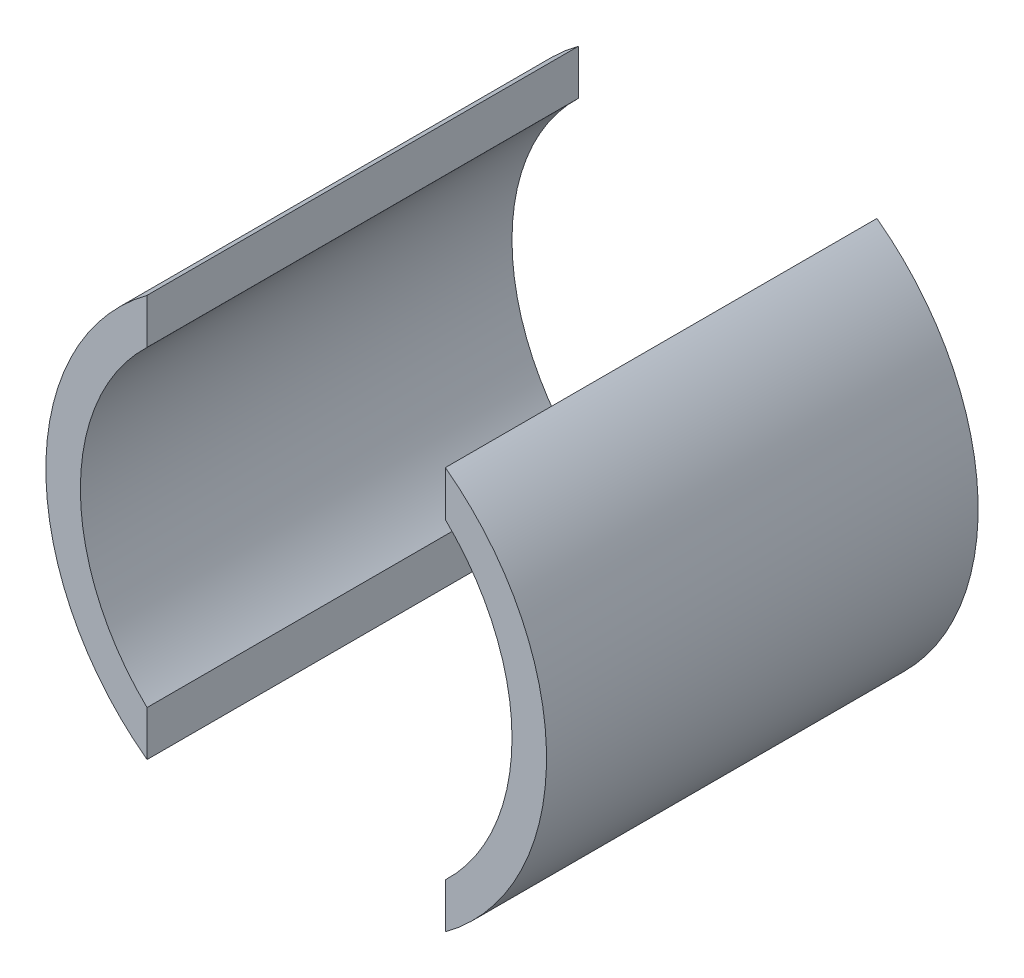
ISO-10303-21;
HEADER;
FILE_DESCRIPTION(('STEP AP214'),'2;1');
FILE_NAME('part.step','',(''),(''),'','','');
FILE_SCHEMA(('AUTOMOTIVE_DESIGN { 1 0 10303 214 1 1 1 1 }'));
ENDSEC;
DATA;
#1=APPLICATION_CONTEXT('core data for automotive mechanical design processes');
#2=APPLICATION_PROTOCOL_DEFINITION('international standard','automotive_design',2000,#1);
#3=PRODUCT_CONTEXT('',#1,'mechanical');
#4=PRODUCT('Part','Part','',(#3));
#5=PRODUCT_RELATED_PRODUCT_CATEGORY('part','',(#4));
#6=PRODUCT_DEFINITION_FORMATION('','',#4);
#7=PRODUCT_DEFINITION_CONTEXT('part definition',#1,'design');
#8=PRODUCT_DEFINITION('design','',#6,#7);
#9=PRODUCT_DEFINITION_SHAPE('','',#8);
#10=(LENGTH_UNIT() NAMED_UNIT(*) SI_UNIT(.MILLI.,.METRE.));
#11=(NAMED_UNIT(*) PLANE_ANGLE_UNIT() SI_UNIT($,.RADIAN.));
#12=(NAMED_UNIT(*) SI_UNIT($,.STERADIAN.) SOLID_ANGLE_UNIT());
#13=UNCERTAINTY_MEASURE_WITH_UNIT(LENGTH_MEASURE(1.E-05),#10,'distance_accuracy_value','');
#14=(GEOMETRIC_REPRESENTATION_CONTEXT(3) GLOBAL_UNCERTAINTY_ASSIGNED_CONTEXT((#13)) GLOBAL_UNIT_ASSIGNED_CONTEXT((#10,
#11,#12)) REPRESENTATION_CONTEXT('',''));
#15=CARTESIAN_POINT('',(0.,0.,0.));
#16=DIRECTION('',(0.,0.,1.));
#17=DIRECTION('',(1.,0.,0.));
#18=AXIS2_PLACEMENT_3D('',#15,#16,#17);
#19=CARTESIAN_POINT('',(0.,0.,50.));
#20=DIRECTION('',(0.,0.,-1.));
#21=DIRECTION('',(-1.,0.,0.));
#22=AXIS2_PLACEMENT_3D('',#19,#20,#21);
#23=CYLINDRICAL_SURFACE('',#22,25.);
#24=CARTESIAN_POINT('',(0.,0.,0.));
#25=DIRECTION('',(0.,0.,-1.));
#26=DIRECTION('',(1.,0.,0.));
#27=AXIS2_PLACEMENT_3D('',#24,#25,#26);
#28=CIRCLE('',#27,25.);
#29=CARTESIAN_POINT('',(-17.2808219178082,-18.0658017769763,0.));
#30=VERTEX_POINT('',#29);
#31=CARTESIAN_POINT('',(-17.2808219178082,18.0658017769763,0.));
#32=VERTEX_POINT('',#31);
#33=EDGE_CURVE('E112',#30,#32,#28,.T.);
#34=ORIENTED_EDGE('',*,*,#33,.T.);
#35=DIRECTION('',(0.,0.,-1.));
#36=VECTOR('',#35,1.);
#37=CARTESIAN_POINT('',(-17.2808219178082,18.0658017769763,50.));
#38=LINE('',#37,#36);
#39=CARTESIAN_POINT('',(-17.2808219178082,18.0658017769763,50.));
#40=VERTEX_POINT('',#39);
#41=EDGE_CURVE('E12',#40,#32,#38,.T.);
#42=ORIENTED_EDGE('',*,*,#41,.F.);
#43=CARTESIAN_POINT('',(0.,0.,50.));
#44=DIRECTION('',(0.,0.,-1.));
#45=DIRECTION('',(1.,0.,0.));
#46=AXIS2_PLACEMENT_3D('',#43,#44,#45);
#47=CIRCLE('',#46,25.);
#48=CARTESIAN_POINT('',(-17.2808219178082,-18.0658017769763,50.));
#49=VERTEX_POINT('',#48);
#50=EDGE_CURVE('E100',#49,#40,#47,.T.);
#51=ORIENTED_EDGE('',*,*,#50,.F.);
#52=DIRECTION('',(0.,0.,-1.));
#53=VECTOR('',#52,1.);
#54=CARTESIAN_POINT('',(-17.2808219178082,-18.0658017769763,50.));
#55=LINE('',#54,#53);
#56=EDGE_CURVE('E108',#49,#30,#55,.T.);
#57=ORIENTED_EDGE('',*,*,#56,.T.);
#58=EDGE_LOOP('',(#34,#42,#51,#57));
#59=FACE_BOUND('',#58,.T.);
#60=ADVANCED_FACE('F49',(#59),#23,.F.);
#61=CARTESIAN_POINT('',(-17.2808219178082,23.2889070985523,50.));
#62=DIRECTION('',(-1.,0.,0.));
#63=DIRECTION('',(0.,0.,1.));
#64=AXIS2_PLACEMENT_3D('',#61,#62,#63);
#65=PLANE('',#64);
#66=DIRECTION('',(0.,1.,0.));
#67=VECTOR('',#66,1.);
#68=CARTESIAN_POINT('',(-17.2808219178082,23.2889070985523,0.));
#69=LINE('',#68,#67);
#70=CARTESIAN_POINT('',(-17.2808219178082,23.2889070985523,0.));
#71=VERTEX_POINT('',#70);
#72=EDGE_CURVE('E104',#32,#71,#69,.T.);
#73=ORIENTED_EDGE('',*,*,#72,.T.);
#74=DIRECTION('',(0.,0.,-1.));
#75=VECTOR('',#74,1.);
#76=CARTESIAN_POINT('',(-17.2808219178082,23.2889070985523,50.));
#77=LINE('',#76,#75);
#78=CARTESIAN_POINT('',(-17.2808219178082,23.2889070985523,50.));
#79=VERTEX_POINT('',#78);
#80=EDGE_CURVE('E57',#79,#71,#77,.T.);
#81=ORIENTED_EDGE('',*,*,#80,.F.);
#82=DIRECTION('',(0.,1.,0.));
#83=VECTOR('',#82,1.);
#84=CARTESIAN_POINT('',(-17.2808219178082,23.2889070985523,50.));
#85=LINE('',#84,#83);
#86=EDGE_CURVE('E95',#40,#79,#85,.T.);
#87=ORIENTED_EDGE('',*,*,#86,.F.);
#88=ORIENTED_EDGE('',*,*,#41,.T.);
#89=EDGE_LOOP('',(#73,#81,#87,#88));
#90=FACE_BOUND('',#89,.T.);
#91=ADVANCED_FACE('F103',(#90),#65,.F.);
#92=CARTESIAN_POINT('',(0.,0.,50.));
#93=DIRECTION('',(0.,0.,-1.));
#94=DIRECTION('',(-1.,0.,0.));
#95=AXIS2_PLACEMENT_3D('',#92,#93,#94);
#96=CYLINDRICAL_SURFACE('',#95,29.);
#97=CARTESIAN_POINT('',(0.,0.,0.));
#98=DIRECTION('',(0.,0.,1.));
#99=DIRECTION('',(1.,0.,0.));
#100=AXIS2_PLACEMENT_3D('',#97,#98,#99);
#101=CIRCLE('',#100,29.);
#102=CARTESIAN_POINT('',(-17.2808219178082,-23.2889070985523,0.));
#103=VERTEX_POINT('',#102);
#104=EDGE_CURVE('E82',#71,#103,#101,.T.);
#105=ORIENTED_EDGE('',*,*,#104,.T.);
#106=DIRECTION('',(0.,0.,-1.));
#107=VECTOR('',#106,1.);
#108=CARTESIAN_POINT('',(-17.2808219178082,-23.2889070985523,50.));
#109=LINE('',#108,#107);
#110=CARTESIAN_POINT('',(-17.2808219178082,-23.2889070985523,50.));
#111=VERTEX_POINT('',#110);
#112=EDGE_CURVE('E105',#111,#103,#109,.T.);
#113=ORIENTED_EDGE('',*,*,#112,.F.);
#114=CARTESIAN_POINT('',(0.,0.,50.));
#115=DIRECTION('',(0.,0.,1.));
#116=DIRECTION('',(1.,0.,0.));
#117=AXIS2_PLACEMENT_3D('',#114,#115,#116);
#118=CIRCLE('',#117,29.);
#119=EDGE_CURVE('E98',#79,#111,#118,.T.);
#120=ORIENTED_EDGE('',*,*,#119,.F.);
#121=ORIENTED_EDGE('',*,*,#80,.T.);
#122=EDGE_LOOP('',(#105,#113,#120,#121));
#123=FACE_BOUND('',#122,.T.);
#124=ADVANCED_FACE('F106',(#123),#96,.T.);
#125=CARTESIAN_POINT('',(-17.2808219178082,-18.0658017769763,50.));
#126=DIRECTION('',(-1.,0.,0.));
#127=DIRECTION('',(0.,0.,1.));
#128=AXIS2_PLACEMENT_3D('',#125,#126,#127);
#129=PLANE('',#128);
#130=DIRECTION('',(0.,1.,0.));
#131=VECTOR('',#130,1.);
#132=CARTESIAN_POINT('',(-17.2808219178082,-18.0658017769763,0.));
#133=LINE('',#132,#131);
#134=EDGE_CURVE('E88',#103,#30,#133,.T.);
#135=ORIENTED_EDGE('',*,*,#134,.T.);
#136=ORIENTED_EDGE('',*,*,#56,.F.);
#137=DIRECTION('',(0.,1.,0.));
#138=VECTOR('',#137,1.);
#139=CARTESIAN_POINT('',(-17.2808219178082,-18.0658017769763,50.));
#140=LINE('',#139,#138);
#141=EDGE_CURVE('E65',#111,#49,#140,.T.);
#142=ORIENTED_EDGE('',*,*,#141,.F.);
#143=ORIENTED_EDGE('',*,*,#112,.T.);
#144=EDGE_LOOP('',(#135,#136,#142,#143));
#145=FACE_BOUND('',#144,.T.);
#146=ADVANCED_FACE('F119',(#145),#129,.F.);
#147=CARTESIAN_POINT('',(0.,0.,50.));
#148=DIRECTION('',(0.,0.,1.));
#149=DIRECTION('',(1.,0.,0.));
#150=AXIS2_PLACEMENT_3D('',#147,#148,#149);
#151=PLANE('',#150);
#152=ORIENTED_EDGE('',*,*,#50,.T.);
#153=ORIENTED_EDGE('',*,*,#86,.T.);
#154=ORIENTED_EDGE('',*,*,#119,.T.);
#155=ORIENTED_EDGE('',*,*,#141,.T.);
#156=EDGE_LOOP('',(#152,#153,#154,#155));
#157=FACE_BOUND('',#156,.T.);
#158=ADVANCED_FACE('F96',(#157),#151,.T.);
#159=CARTESIAN_POINT('',(0.,0.,0.));
#160=DIRECTION('',(0.,0.,1.));
#161=DIRECTION('',(1.,0.,0.));
#162=AXIS2_PLACEMENT_3D('',#159,#160,#161);
#163=PLANE('',#162);
#164=ORIENTED_EDGE('',*,*,#33,.F.);
#165=ORIENTED_EDGE('',*,*,#134,.F.);
#166=ORIENTED_EDGE('',*,*,#104,.F.);
#167=ORIENTED_EDGE('',*,*,#72,.F.);
#168=EDGE_LOOP('',(#164,#165,#166,#167));
#169=FACE_BOUND('',#168,.T.);
#170=ADVANCED_FACE('F122',(#169),#163,.F.);
#171=CLOSED_SHELL('',(#60,#91,#124,#146,#158,#170));
#172=MANIFOLD_SOLID_BREP('B2',#171);
#173=CARTESIAN_POINT('',(0.,0.,50.));
#174=DIRECTION('',(0.,0.,-1.));
#175=DIRECTION('',(-1.,0.,0.));
#176=AXIS2_PLACEMENT_3D('',#173,#174,#175);
#177=CYLINDRICAL_SURFACE('',#176,25.);
#178=CARTESIAN_POINT('',(0.,0.,0.));
#179=DIRECTION('',(0.,0.,-1.));
#180=DIRECTION('',(1.,0.,0.));
#181=AXIS2_PLACEMENT_3D('',#178,#179,#180);
#182=CIRCLE('',#181,25.);
#183=CARTESIAN_POINT('',(17.2808219178082,18.0658017769763,0.));
#184=VERTEX_POINT('',#183);
#185=CARTESIAN_POINT('',(17.2808219178082,-18.0658017769763,0.));
#186=VERTEX_POINT('',#185);
#187=EDGE_CURVE('E241',#184,#186,#182,.T.);
#188=ORIENTED_EDGE('',*,*,#187,.T.);
#189=DIRECTION('',(0.,0.,-1.));
#190=VECTOR('',#189,1.);
#191=CARTESIAN_POINT('',(17.2808219178082,-18.0658017769763,50.));
#192=LINE('',#191,#190);
#193=CARTESIAN_POINT('',(17.2808219178082,-18.0658017769763,50.));
#194=VERTEX_POINT('',#193);
#195=EDGE_CURVE('E47',#194,#186,#192,.T.);
#196=ORIENTED_EDGE('',*,*,#195,.F.);
#197=CARTESIAN_POINT('',(0.,0.,50.));
#198=DIRECTION('',(0.,0.,-1.));
#199=DIRECTION('',(1.,0.,0.));
#200=AXIS2_PLACEMENT_3D('',#197,#198,#199);
#201=CIRCLE('',#200,25.);
#202=CARTESIAN_POINT('',(17.2808219178082,18.0658017769763,50.));
#203=VERTEX_POINT('',#202);
#204=EDGE_CURVE('E225',#203,#194,#201,.T.);
#205=ORIENTED_EDGE('',*,*,#204,.F.);
#206=DIRECTION('',(0.,0.,-1.));
#207=VECTOR('',#206,1.);
#208=CARTESIAN_POINT('',(17.2808219178082,18.0658017769763,50.));
#209=LINE('',#208,#207);
#210=EDGE_CURVE('E237',#203,#184,#209,.T.);
#211=ORIENTED_EDGE('',*,*,#210,.T.);
#212=EDGE_LOOP('',(#188,#196,#205,#211));
#213=FACE_BOUND('',#212,.T.);
#214=ADVANCED_FACE('F173',(#213),#177,.F.);
#215=CARTESIAN_POINT('',(17.2808219178082,-18.0658017769763,50.));
#216=DIRECTION('',(1.,0.,0.));
#217=DIRECTION('',(0.,0.,-1.));
#218=AXIS2_PLACEMENT_3D('',#215,#216,#217);
#219=PLANE('',#218);
#220=DIRECTION('',(0.,-1.,0.));
#221=VECTOR('',#220,1.);
#222=CARTESIAN_POINT('',(17.2808219178082,-18.0658017769763,0.));
#223=LINE('',#222,#221);
#224=CARTESIAN_POINT('',(17.2808219178082,-23.2889070985523,0.));
#225=VERTEX_POINT('',#224);
#226=EDGE_CURVE('E230',#186,#225,#223,.T.);
#227=ORIENTED_EDGE('',*,*,#226,.T.);
#228=DIRECTION('',(0.,0.,-1.));
#229=VECTOR('',#228,1.);
#230=CARTESIAN_POINT('',(17.2808219178082,-23.2889070985523,50.));
#231=LINE('',#230,#229);
#232=CARTESIAN_POINT('',(17.2808219178082,-23.2889070985523,50.));
#233=VERTEX_POINT('',#232);
#234=EDGE_CURVE('E182',#233,#225,#231,.T.);
#235=ORIENTED_EDGE('',*,*,#234,.F.);
#236=DIRECTION('',(0.,-1.,0.));
#237=VECTOR('',#236,1.);
#238=CARTESIAN_POINT('',(17.2808219178082,-18.0658017769763,50.));
#239=LINE('',#238,#237);
#240=EDGE_CURVE('E220',#194,#233,#239,.T.);
#241=ORIENTED_EDGE('',*,*,#240,.F.);
#242=ORIENTED_EDGE('',*,*,#195,.T.);
#243=EDGE_LOOP('',(#227,#235,#241,#242));
#244=FACE_BOUND('',#243,.T.);
#245=ADVANCED_FACE('F229',(#244),#219,.F.);
#246=CARTESIAN_POINT('',(0.,0.,50.));
#247=DIRECTION('',(0.,0.,-1.));
#248=DIRECTION('',(-1.,0.,0.));
#249=AXIS2_PLACEMENT_3D('',#246,#247,#248);
#250=CYLINDRICAL_SURFACE('',#249,29.);
#251=CARTESIAN_POINT('',(0.,0.,0.));
#252=DIRECTION('',(0.,0.,1.));
#253=DIRECTION('',(1.,0.,0.));
#254=AXIS2_PLACEMENT_3D('',#251,#252,#253);
#255=CIRCLE('',#254,29.);
#256=CARTESIAN_POINT('',(17.2808219178082,23.2889070985523,0.));
#257=VERTEX_POINT('',#256);
#258=EDGE_CURVE('E207',#225,#257,#255,.T.);
#259=ORIENTED_EDGE('',*,*,#258,.T.);
#260=DIRECTION('',(0.,0.,-1.));
#261=VECTOR('',#260,1.);
#262=CARTESIAN_POINT('',(17.2808219178082,23.2889070985523,50.));
#263=LINE('',#262,#261);
#264=CARTESIAN_POINT('',(17.2808219178082,23.2889070985523,50.));
#265=VERTEX_POINT('',#264);
#266=EDGE_CURVE('E232',#265,#257,#263,.T.);
#267=ORIENTED_EDGE('',*,*,#266,.F.);
#268=CARTESIAN_POINT('',(0.,0.,50.));
#269=DIRECTION('',(0.,0.,1.));
#270=DIRECTION('',(1.,0.,0.));
#271=AXIS2_PLACEMENT_3D('',#268,#269,#270);
#272=CIRCLE('',#271,29.);
#273=EDGE_CURVE('E223',#233,#265,#272,.T.);
#274=ORIENTED_EDGE('',*,*,#273,.F.);
#275=ORIENTED_EDGE('',*,*,#234,.T.);
#276=EDGE_LOOP('',(#259,#267,#274,#275));
#277=FACE_BOUND('',#276,.T.);
#278=ADVANCED_FACE('F233',(#277),#250,.T.);
#279=CARTESIAN_POINT('',(17.2808219178082,23.2889070985523,50.));
#280=DIRECTION('',(1.,0.,0.));
#281=DIRECTION('',(0.,0.,-1.));
#282=AXIS2_PLACEMENT_3D('',#279,#280,#281);
#283=PLANE('',#282);
#284=DIRECTION('',(0.,-1.,0.));
#285=VECTOR('',#284,1.);
#286=CARTESIAN_POINT('',(17.2808219178082,23.2889070985523,0.));
#287=LINE('',#286,#285);
#288=EDGE_CURVE('E213',#257,#184,#287,.T.);
#289=ORIENTED_EDGE('',*,*,#288,.T.);
#290=ORIENTED_EDGE('',*,*,#210,.F.);
#291=DIRECTION('',(0.,-1.,0.));
#292=VECTOR('',#291,1.);
#293=CARTESIAN_POINT('',(17.2808219178082,23.2889070985523,50.));
#294=LINE('',#293,#292);
#295=EDGE_CURVE('E190',#265,#203,#294,.T.);
#296=ORIENTED_EDGE('',*,*,#295,.F.);
#297=ORIENTED_EDGE('',*,*,#266,.T.);
#298=EDGE_LOOP('',(#289,#290,#296,#297));
#299=FACE_BOUND('',#298,.T.);
#300=ADVANCED_FACE('F254',(#299),#283,.F.);
#301=CARTESIAN_POINT('',(0.,0.,50.));
#302=DIRECTION('',(0.,0.,1.));
#303=DIRECTION('',(1.,0.,0.));
#304=AXIS2_PLACEMENT_3D('',#301,#302,#303);
#305=PLANE('',#304);
#306=ORIENTED_EDGE('',*,*,#204,.T.);
#307=ORIENTED_EDGE('',*,*,#240,.T.);
#308=ORIENTED_EDGE('',*,*,#273,.T.);
#309=ORIENTED_EDGE('',*,*,#295,.T.);
#310=EDGE_LOOP('',(#306,#307,#308,#309));
#311=FACE_BOUND('',#310,.T.);
#312=ADVANCED_FACE('F221',(#311),#305,.T.);
#313=CARTESIAN_POINT('',(0.,0.,0.));
#314=DIRECTION('',(0.,0.,1.));
#315=DIRECTION('',(1.,0.,0.));
#316=AXIS2_PLACEMENT_3D('',#313,#314,#315);
#317=PLANE('',#316);
#318=ORIENTED_EDGE('',*,*,#187,.F.);
#319=ORIENTED_EDGE('',*,*,#288,.F.);
#320=ORIENTED_EDGE('',*,*,#258,.F.);
#321=ORIENTED_EDGE('',*,*,#226,.F.);
#322=EDGE_LOOP('',(#318,#319,#320,#321));
#323=FACE_BOUND('',#322,.T.);
#324=ADVANCED_FACE('F257',(#323),#317,.F.);
#325=CLOSED_SHELL('',(#214,#245,#278,#300,#312,#324));
#326=MANIFOLD_SOLID_BREP('B6',#325);
#327=ADVANCED_BREP_SHAPE_REPRESENTATION('',(#18,#172,#326),#14);
#328=SHAPE_DEFINITION_REPRESENTATION(#9,#327);
ENDSEC;
END-ISO-10303-21;
